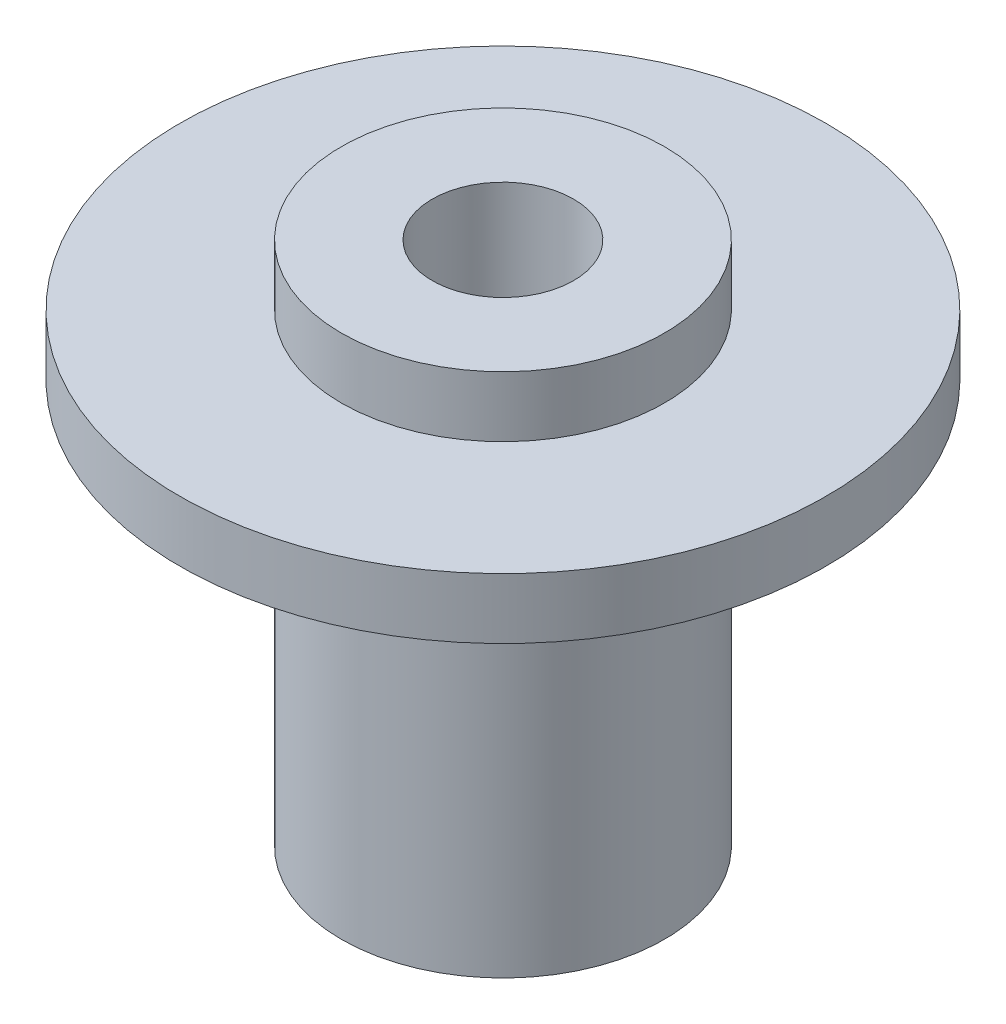
ISO-10303-21;
HEADER;
FILE_DESCRIPTION(('STEP AP214'),'2;1');
FILE_NAME('part.step','',(''),(''),'','','');
FILE_SCHEMA(('AUTOMOTIVE_DESIGN { 1 0 10303 214 1 1 1 1 }'));
ENDSEC;
DATA;
#1=APPLICATION_CONTEXT('core data for automotive mechanical design processes');
#2=APPLICATION_PROTOCOL_DEFINITION('international standard','automotive_design',2000,#1);
#3=PRODUCT_CONTEXT('',#1,'mechanical');
#4=PRODUCT('Part','Part','',(#3));
#5=PRODUCT_RELATED_PRODUCT_CATEGORY('part','',(#4));
#6=PRODUCT_DEFINITION_FORMATION('','',#4);
#7=PRODUCT_DEFINITION_CONTEXT('part definition',#1,'design');
#8=PRODUCT_DEFINITION('design','',#6,#7);
#9=PRODUCT_DEFINITION_SHAPE('','',#8);
#10=(LENGTH_UNIT() NAMED_UNIT(*) SI_UNIT(.MILLI.,.METRE.));
#11=(NAMED_UNIT(*) PLANE_ANGLE_UNIT() SI_UNIT($,.RADIAN.));
#12=(NAMED_UNIT(*) SI_UNIT($,.STERADIAN.) SOLID_ANGLE_UNIT());
#13=UNCERTAINTY_MEASURE_WITH_UNIT(LENGTH_MEASURE(1.E-05),#10,'distance_accuracy_value','');
#14=(GEOMETRIC_REPRESENTATION_CONTEXT(3) GLOBAL_UNCERTAINTY_ASSIGNED_CONTEXT((#13)) GLOBAL_UNIT_ASSIGNED_CONTEXT((#10,
#11,#12)) REPRESENTATION_CONTEXT('',''));
#15=CARTESIAN_POINT('',(0.,0.,0.));
#16=DIRECTION('',(0.,0.,1.));
#17=DIRECTION('',(1.,0.,0.));
#18=AXIS2_PLACEMENT_3D('',#15,#16,#17);
#19=CARTESIAN_POINT('',(0.,-55.,0.));
#20=DIRECTION('',(0.,-1.,0.));
#21=DIRECTION('',(0.,0.,-1.));
#22=AXIS2_PLACEMENT_3D('',#19,#20,#21);
#23=CYLINDRICAL_SURFACE('',#22,80.);
#24=CARTESIAN_POINT('',(0.,0.,0.));
#25=DIRECTION('',(0.,-1.,0.));
#26=DIRECTION('',(0.,0.,-1.));
#27=AXIS2_PLACEMENT_3D('',#24,#25,#26);
#28=CIRCLE('',#27,80.);
#29=CARTESIAN_POINT('',(0.,0.,-80.));
#30=VERTEX_POINT('',#29);
#31=EDGE_CURVE('E10',#30,#30,#28,.T.);
#32=ORIENTED_EDGE('',*,*,#31,.F.);
#33=EDGE_LOOP('',(#32));
#34=FACE_BOUND('',#33,.T.);
#35=CARTESIAN_POINT('',(0.,30.,0.));
#36=DIRECTION('',(0.,-1.,0.));
#37=DIRECTION('',(0.,0.,-1.));
#38=AXIS2_PLACEMENT_3D('',#35,#36,#37);
#39=CIRCLE('',#38,80.);
#40=CARTESIAN_POINT('',(0.,30.,-80.));
#41=VERTEX_POINT('',#40);
#42=EDGE_CURVE('E67',#41,#41,#39,.T.);
#43=ORIENTED_EDGE('',*,*,#42,.T.);
#44=EDGE_LOOP('',(#43));
#45=FACE_BOUND('',#44,.T.);
#46=ADVANCED_FACE('F45',(#34,#45),#23,.T.);
#47=CARTESIAN_POINT('',(0.,0.,0.));
#48=DIRECTION('',(0.,1.,0.));
#49=DIRECTION('',(0.,0.,1.));
#50=AXIS2_PLACEMENT_3D('',#47,#48,#49);
#51=PLANE('',#50);
#52=ORIENTED_EDGE('',*,*,#31,.T.);
#53=EDGE_LOOP('',(#52));
#54=FACE_BOUND('',#53,.T.);
#55=CARTESIAN_POINT('',(0.,0.,0.));
#56=DIRECTION('',(0.,-1.,0.));
#57=DIRECTION('',(0.,0.,-1.));
#58=AXIS2_PLACEMENT_3D('',#55,#56,#57);
#59=CIRCLE('',#58,160.);
#60=CARTESIAN_POINT('',(0.,0.,-160.));
#61=VERTEX_POINT('',#60);
#62=EDGE_CURVE('E52',#61,#61,#59,.T.);
#63=ORIENTED_EDGE('',*,*,#62,.F.);
#64=EDGE_LOOP('',(#63));
#65=FACE_BOUND('',#64,.T.);
#66=ADVANCED_FACE('F87',(#54,#65),#51,.T.);
#67=CARTESIAN_POINT('',(0.,-55.,0.));
#68=DIRECTION('',(0.,-1.,0.));
#69=DIRECTION('',(0.,0.,-1.));
#70=AXIS2_PLACEMENT_3D('',#67,#68,#69);
#71=CYLINDRICAL_SURFACE('',#70,160.);
#72=CARTESIAN_POINT('',(0.,-30.,0.));
#73=DIRECTION('',(0.,-1.,0.));
#74=DIRECTION('',(0.,0.,-1.));
#75=AXIS2_PLACEMENT_3D('',#72,#73,#74);
#76=CIRCLE('',#75,160.);
#77=CARTESIAN_POINT('',(0.,-30.,-160.));
#78=VERTEX_POINT('',#77);
#79=EDGE_CURVE('E56',#78,#78,#76,.T.);
#80=ORIENTED_EDGE('',*,*,#79,.F.);
#81=EDGE_LOOP('',(#80));
#82=FACE_BOUND('',#81,.T.);
#83=ORIENTED_EDGE('',*,*,#62,.T.);
#84=EDGE_LOOP('',(#83));
#85=FACE_BOUND('',#84,.T.);
#86=ADVANCED_FACE('F92',(#82,#85),#71,.T.);
#87=CARTESIAN_POINT('',(0.,-30.,0.));
#88=DIRECTION('',(0.,1.,0.));
#89=DIRECTION('',(0.,0.,1.));
#90=AXIS2_PLACEMENT_3D('',#87,#88,#89);
#91=PLANE('',#90);
#92=CARTESIAN_POINT('',(0.,-30.,0.));
#93=DIRECTION('',(0.,-1.,0.));
#94=DIRECTION('',(0.,0.,-1.));
#95=AXIS2_PLACEMENT_3D('',#92,#93,#94);
#96=CIRCLE('',#95,80.);
#97=CARTESIAN_POINT('',(0.,-30.,-80.));
#98=VERTEX_POINT('',#97);
#99=EDGE_CURVE('E61',#98,#98,#96,.T.);
#100=ORIENTED_EDGE('',*,*,#99,.F.);
#101=EDGE_LOOP('',(#100));
#102=FACE_BOUND('',#101,.T.);
#103=ORIENTED_EDGE('',*,*,#79,.T.);
#104=EDGE_LOOP('',(#103));
#105=FACE_BOUND('',#104,.T.);
#106=ADVANCED_FACE('F96',(#102,#105),#91,.F.);
#107=CARTESIAN_POINT('',(0.,-55.,0.));
#108=DIRECTION('',(0.,-1.,0.));
#109=DIRECTION('',(0.,0.,-1.));
#110=AXIS2_PLACEMENT_3D('',#107,#108,#109);
#111=CYLINDRICAL_SURFACE('',#110,80.);
#112=CARTESIAN_POINT('',(0.,-230.,0.));
#113=DIRECTION('',(0.,-1.,0.));
#114=DIRECTION('',(0.,0.,-1.));
#115=AXIS2_PLACEMENT_3D('',#112,#113,#114);
#116=CIRCLE('',#115,80.);
#117=CARTESIAN_POINT('',(0.,-230.,-80.));
#118=VERTEX_POINT('',#117);
#119=EDGE_CURVE('E64',#118,#118,#116,.T.);
#120=ORIENTED_EDGE('',*,*,#119,.F.);
#121=EDGE_LOOP('',(#120));
#122=FACE_BOUND('',#121,.T.);
#123=ORIENTED_EDGE('',*,*,#99,.T.);
#124=EDGE_LOOP('',(#123));
#125=FACE_BOUND('',#124,.T.);
#126=ADVANCED_FACE('F103',(#122,#125),#111,.T.);
#127=CARTESIAN_POINT('',(1.59594559789866E-13,-230.,0.));
#128=DIRECTION('',(0.,1.,0.));
#129=DIRECTION('',(0.,0.,1.));
#130=AXIS2_PLACEMENT_3D('',#127,#128,#129);
#131=PLANE('',#130);
#132=CARTESIAN_POINT('',(0.,-230.,0.));
#133=DIRECTION('',(0.,1.,0.));
#134=DIRECTION('',(0.,0.,1.));
#135=AXIS2_PLACEMENT_3D('',#132,#133,#134);
#136=CIRCLE('',#135,35.);
#137=CARTESIAN_POINT('',(0.,-230.,35.));
#138=VERTEX_POINT('',#137);
#139=EDGE_CURVE('E70',#138,#138,#136,.F.);
#140=ORIENTED_EDGE('',*,*,#139,.F.);
#141=EDGE_LOOP('',(#140));
#142=FACE_BOUND('',#141,.T.);
#143=ORIENTED_EDGE('',*,*,#119,.T.);
#144=EDGE_LOOP('',(#143));
#145=FACE_BOUND('',#144,.T.);
#146=ADVANCED_FACE('F82',(#142,#145),#131,.F.);
#147=CARTESIAN_POINT('',(0.,30.,0.));
#148=DIRECTION('',(0.,-1.,0.));
#149=DIRECTION('',(0.,0.,-1.));
#150=AXIS2_PLACEMENT_3D('',#147,#148,#149);
#151=PLANE('',#150);
#152=CARTESIAN_POINT('',(0.,30.,0.));
#153=DIRECTION('',(0.,-1.,0.));
#154=DIRECTION('',(0.,0.,-1.));
#155=AXIS2_PLACEMENT_3D('',#152,#153,#154);
#156=CIRCLE('',#155,35.);
#157=CARTESIAN_POINT('',(0.,30.,-35.));
#158=VERTEX_POINT('',#157);
#159=EDGE_CURVE('E48',#158,#158,#156,.F.);
#160=ORIENTED_EDGE('',*,*,#159,.F.);
#161=EDGE_LOOP('',(#160));
#162=FACE_BOUND('',#161,.T.);
#163=ORIENTED_EDGE('',*,*,#42,.F.);
#164=EDGE_LOOP('',(#163));
#165=FACE_BOUND('',#164,.T.);
#166=ADVANCED_FACE('F79',(#162,#165),#151,.F.);
#167=CARTESIAN_POINT('',(0.,-55.,0.));
#168=DIRECTION('',(0.,-1.,0.));
#169=DIRECTION('',(0.,0.,-1.));
#170=AXIS2_PLACEMENT_3D('',#167,#168,#169);
#171=CYLINDRICAL_SURFACE('',#170,35.);
#172=ORIENTED_EDGE('',*,*,#159,.T.);
#173=EDGE_LOOP('',(#172));
#174=FACE_BOUND('',#173,.T.);
#175=ORIENTED_EDGE('',*,*,#139,.T.);
#176=EDGE_LOOP('',(#175));
#177=FACE_BOUND('',#176,.T.);
#178=ADVANCED_FACE('F77',(#174,#177),#171,.F.);
#179=CLOSED_SHELL('',(#46,#66,#86,#106,#126,#146,#166,#178));
#180=MANIFOLD_SOLID_BREP('B2',#179);
#181=ADVANCED_BREP_SHAPE_REPRESENTATION('',(#18,#180),#14);
#182=SHAPE_DEFINITION_REPRESENTATION(#9,#181);
ENDSEC;
END-ISO-10303-21;
